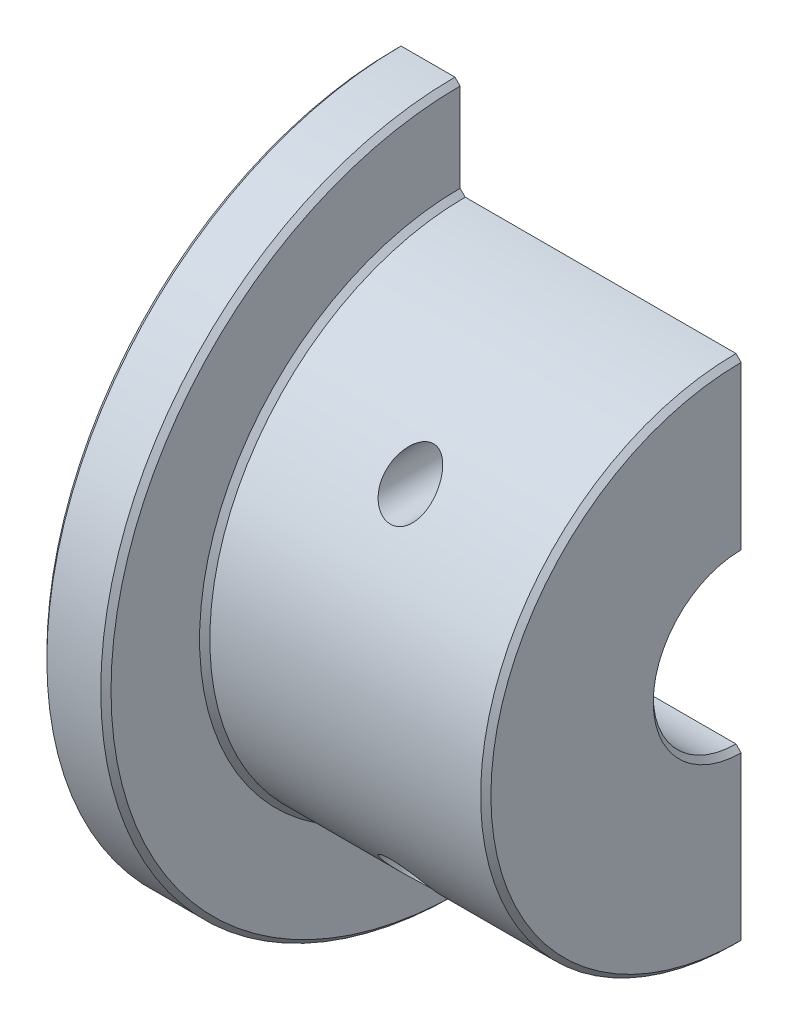
ISO-10303-21;
HEADER;
FILE_DESCRIPTION(('STEP AP214'),'2;1');
FILE_NAME('part.step','',(''),(''),'','','');
FILE_SCHEMA(('AUTOMOTIVE_DESIGN { 1 0 10303 214 1 1 1 1 }'));
ENDSEC;
DATA;
#1=APPLICATION_CONTEXT('core data for automotive mechanical design processes');
#2=APPLICATION_PROTOCOL_DEFINITION('international standard','automotive_design',2000,#1);
#3=PRODUCT_CONTEXT('',#1,'mechanical');
#4=PRODUCT('Part','Part','',(#3));
#5=PRODUCT_RELATED_PRODUCT_CATEGORY('part','',(#4));
#6=PRODUCT_DEFINITION_FORMATION('','',#4);
#7=PRODUCT_DEFINITION_CONTEXT('part definition',#1,'design');
#8=PRODUCT_DEFINITION('design','',#6,#7);
#9=PRODUCT_DEFINITION_SHAPE('','',#8);
#10=(LENGTH_UNIT() NAMED_UNIT(*) SI_UNIT(.MILLI.,.METRE.));
#11=(NAMED_UNIT(*) PLANE_ANGLE_UNIT() SI_UNIT($,.RADIAN.));
#12=(NAMED_UNIT(*) SI_UNIT($,.STERADIAN.) SOLID_ANGLE_UNIT());
#13=UNCERTAINTY_MEASURE_WITH_UNIT(LENGTH_MEASURE(1.E-05),#10,'distance_accuracy_value','');
#14=(GEOMETRIC_REPRESENTATION_CONTEXT(3) GLOBAL_UNCERTAINTY_ASSIGNED_CONTEXT((#13)) GLOBAL_UNIT_ASSIGNED_CONTEXT((#10,
#11,#12)) REPRESENTATION_CONTEXT('',''));
#15=CARTESIAN_POINT('',(0.,0.,0.));
#16=DIRECTION('',(0.,0.,1.));
#17=DIRECTION('',(1.,0.,0.));
#18=AXIS2_PLACEMENT_3D('',#15,#16,#17);
#19=CARTESIAN_POINT('',(4.7625,0.,0.));
#20=DIRECTION('',(1.,0.,0.));
#21=DIRECTION('',(0.,0.,-1.));
#22=AXIS2_PLACEMENT_3D('',#19,#20,#21);
#23=PLANE('',#22);
#24=CARTESIAN_POINT('',(4.7625,0.,0.));
#25=DIRECTION('',(-1.,0.,0.));
#26=DIRECTION('',(0.,0.,1.));
#27=AXIS2_PLACEMENT_3D('',#24,#25,#26);
#28=CIRCLE('',#27,10.16);
#29=CARTESIAN_POINT('',(4.7625,-10.16,0.));
#30=VERTEX_POINT('',#29);
#31=CARTESIAN_POINT('',(4.7625,10.16,0.));
#32=VERTEX_POINT('',#31);
#33=EDGE_CURVE('E56',#30,#32,#28,.T.);
#34=ORIENTED_EDGE('',*,*,#33,.F.);
#35=DIRECTION('',(0.,-1.,0.));
#36=VECTOR('',#35,1.);
#37=CARTESIAN_POINT('',(4.7625,0.,0.));
#38=LINE('',#37,#36);
#39=CARTESIAN_POINT('',(4.7625,-17.272,0.));
#40=VERTEX_POINT('',#39);
#41=EDGE_CURVE('E225',#30,#40,#38,.T.);
#42=ORIENTED_EDGE('',*,*,#41,.T.);
#43=CARTESIAN_POINT('',(4.7625,0.,0.));
#44=DIRECTION('',(1.,0.,0.));
#45=DIRECTION('',(0.,0.,-1.));
#46=AXIS2_PLACEMENT_3D('',#43,#44,#45);
#47=CIRCLE('',#46,17.272);
#48=CARTESIAN_POINT('',(4.7625,17.272,0.));
#49=VERTEX_POINT('',#48);
#50=EDGE_CURVE('E257',#40,#49,#47,.F.);
#51=ORIENTED_EDGE('',*,*,#50,.T.);
#52=EDGE_CURVE('E222',#49,#32,#38,.T.);
#53=ORIENTED_EDGE('',*,*,#52,.T.);
#54=EDGE_LOOP('',(#34,#42,#51,#53));
#55=FACE_BOUND('',#54,.T.);
#56=ADVANCED_FACE('F41',(#55),#23,.F.);
#57=CARTESIAN_POINT('',(4.7625,0.,0.));
#58=DIRECTION('',(1.,0.,0.));
#59=DIRECTION('',(0.,0.,1.));
#60=AXIS2_PLACEMENT_3D('',#57,#58,#59);
#61=CIRCLE('',#60,6.604);
#62=CARTESIAN_POINT('',(4.7625,6.604,0.));
#63=VERTEX_POINT('',#62);
#64=CARTESIAN_POINT('',(4.7625,-6.604,0.));
#65=VERTEX_POINT('',#64);
#66=EDGE_CURVE('E64',#63,#65,#61,.T.);
#67=ORIENTED_EDGE('',*,*,#66,.F.);
#68=CARTESIAN_POINT('',(4.7625,4.09575,0.));
#69=VERTEX_POINT('',#68);
#70=EDGE_CURVE('E221',#63,#69,#38,.T.);
#71=ORIENTED_EDGE('',*,*,#70,.T.);
#72=CARTESIAN_POINT('',(4.7625,0.,0.));
#73=DIRECTION('',(-1.,0.,0.));
#74=DIRECTION('',(0.,0.,1.));
#75=AXIS2_PLACEMENT_3D('',#72,#73,#74);
#76=CIRCLE('',#75,4.09575);
#77=CARTESIAN_POINT('',(4.7625,-4.09575,0.));
#78=VERTEX_POINT('',#77);
#79=EDGE_CURVE('E256',#69,#78,#76,.F.);
#80=ORIENTED_EDGE('',*,*,#79,.T.);
#81=EDGE_CURVE('E226',#78,#65,#38,.T.);
#82=ORIENTED_EDGE('',*,*,#81,.T.);
#83=EDGE_LOOP('',(#67,#71,#80,#82));
#84=FACE_BOUND('',#83,.T.);
#85=ADVANCED_FACE('F344',(#84),#23,.F.);
#86=CARTESIAN_POINT('',(21.844,0.,0.));
#87=DIRECTION('',(-1.,0.,0.));
#88=DIRECTION('',(0.,0.,1.));
#89=AXIS2_PLACEMENT_3D('',#86,#87,#88);
#90=CYLINDRICAL_SURFACE('',#89,12.6365);
#91=CARTESIAN_POINT('',(13.700125,8.366125,9.47043213028714));
#92=CARTESIAN_POINT('',(13.7001249621737,8.44128960350718,9.40402911952569));
#93=CARTESIAN_POINT('',(13.7072361151167,8.51572369041379,9.33667011488809));
#94=CARTESIAN_POINT('',(13.7350160890176,8.66180315074099,9.20132063768795));
#95=CARTESIAN_POINT('',(13.7557355816915,8.73343703698933,9.13332874500871));
#96=CARTESIAN_POINT('',(13.8163498860264,8.88711774234203,8.98409258127698));
#97=CARTESIAN_POINT('',(13.8593519848088,8.96820308461127,8.90305530751382));
#98=CARTESIAN_POINT('',(13.9389738165955,9.08297069365219,8.78543190710075));
#99=CARTESIAN_POINT('',(13.9680067263493,9.12005786224692,8.7469070029641));
#100=CARTESIAN_POINT('',(14.0313495310548,9.19153226741887,8.67176676838497));
#101=CARTESIAN_POINT('',(14.0656544591567,9.2259219997043,8.63514968358997));
#102=CARTESIAN_POINT('',(14.1425495101344,9.29381356195197,8.56205753877473));
#103=CARTESIAN_POINT('',(14.185562891196,9.32706504405481,8.52579008631979));
#104=CARTESIAN_POINT('',(14.2782751918706,9.38864623833255,8.45792800520883));
#105=CARTESIAN_POINT('',(14.3279631674423,9.41698383692184,8.42632590136842));
#106=CARTESIAN_POINT('',(14.4234241849854,9.4622076821949,8.37548085591997));
#107=CARTESIAN_POINT('',(14.4679954430909,9.48025067443462,8.35503011842458));
#108=CARTESIAN_POINT('',(14.5610112526392,9.51122605133018,8.31975146262236));
#109=CARTESIAN_POINT('',(14.6094529568515,9.52416215191755,8.30491945627258));
#110=CARTESIAN_POINT('',(14.7096767770832,9.54401709267878,8.28209562937027));
#111=CARTESIAN_POINT('',(14.7614865672625,9.55087679133372,8.27417105033155));
#112=CARTESIAN_POINT('',(14.866147097949,9.55764691457447,8.26635042790922));
#113=CARTESIAN_POINT('',(14.9189968964914,9.55756336218896,8.26644742608613));
#114=CARTESIAN_POINT('',(15.0157504177274,9.55101257425573,8.27401381318431));
#115=CARTESIAN_POINT('',(15.0598138637474,9.5454982904683,8.28038264555512));
#116=CARTESIAN_POINT('',(15.1460124112454,9.52989036883062,8.29834096323622));
#117=CARTESIAN_POINT('',(15.1881465909176,9.51979456654955,8.3099329160687));
#118=CARTESIAN_POINT('',(15.2826106420355,9.49180979450326,8.34189758731687));
#119=CARTESIAN_POINT('',(15.3339589529615,9.47246665072018,8.36388715094059));
#120=CARTESIAN_POINT('',(15.4312545954451,9.42834491551374,8.41359332600756));
#121=CARTESIAN_POINT('',(15.4771910603997,9.4035556651263,8.44132116197137));
#122=CARTESIAN_POINT('',(15.581828496394,9.33836089460264,8.51348243156677));
#123=CARTESIAN_POINT('',(15.637713417752,9.29578440203451,8.56002203547779));
#124=CARTESIAN_POINT('',(15.7389537031895,9.20445696034513,8.65815436828773));
#125=CARTESIAN_POINT('',(15.7842885811613,9.15569427778544,8.70975665635828));
#126=CARTESIAN_POINT('',(15.8798837865719,9.03479614917057,8.83536480962547));
#127=CARTESIAN_POINT('',(15.9258857711021,8.96063317636269,8.91066437246362));
#128=CARTESIAN_POINT('',(16.0004289403033,8.80608355331776,9.06343659892184));
#129=CARTESIAN_POINT('',(16.0289547496607,8.72569149264322,9.14091111355555));
#130=CARTESIAN_POINT('',(16.0687244211291,8.55942999041986,9.29679770710956));
#131=CARTESIAN_POINT('',(16.0797252615439,8.47350043368963,9.37520802989711));
#132=CARTESIAN_POINT('',(16.0826792371569,8.2993125935185,9.52974561292135));
#133=CARTESIAN_POINT('',(16.0746520027033,8.2110568028427,9.60587514407854));
#134=CARTESIAN_POINT('',(16.0415814815943,8.05248371527792,9.73895054505186));
#135=CARTESIAN_POINT('',(16.0202263348612,7.98207817019831,9.79670788073001));
#136=CARTESIAN_POINT('',(15.9632159308205,7.84363895408847,9.90789073469402));
#137=CARTESIAN_POINT('',(15.9275779435652,7.77560252604347,9.96132139111971));
#138=CARTESIAN_POINT('',(15.8498005958787,7.65777788614727,10.0520630109625));
#139=CARTESIAN_POINT('',(15.8103629372137,7.60705115204527,10.0904667233611));
#140=CARTESIAN_POINT('',(15.7216601414133,7.51088148760151,10.1622526429461));
#141=CARTESIAN_POINT('',(15.672405777788,7.4654328505098,10.1956402852688));
#142=CARTESIAN_POINT('',(15.5730198476984,7.38868287154303,10.2513603892714));
#143=CARTESIAN_POINT('',(15.5242533773118,7.35628079810179,10.2746059843722));
#144=CARTESIAN_POINT('',(15.4207548269383,7.2983262525384,10.3158534857517));
#145=CARTESIAN_POINT('',(15.3660247583626,7.2727714809453,10.3338571525589));
#146=CARTESIAN_POINT('',(15.2515248833607,7.22982100029259,10.363952886819));
#147=CARTESIAN_POINT('',(15.1917288785629,7.21247119674575,10.3760117093675));
#148=CARTESIAN_POINT('',(15.0692236294389,7.18729582121187,10.3934668325949));
#149=CARTESIAN_POINT('',(15.0065158219238,7.17946560262023,10.3988663837492));
#150=CARTESIAN_POINT('',(14.8867893651784,7.17415241603533,10.4025321224922));
#151=CARTESIAN_POINT('',(14.8298308993087,7.17571044278515,10.4014594311292));
#152=CARTESIAN_POINT('',(14.717104639766,7.18687057676073,10.3937514471977));
#153=CARTESIAN_POINT('',(14.6613366031128,7.19647102602101,10.3871173011368));
#154=CARTESIAN_POINT('',(14.5537672382196,7.22286990585791,10.3687767154043));
#155=CARTESIAN_POINT('',(14.501905528428,7.23950480042156,10.3571854528784));
#156=CARTESIAN_POINT('',(14.4019952945143,7.27911215682411,10.3293872611446));
#157=CARTESIAN_POINT('',(14.35394761423,7.30208601612763,10.3131793141342));
#158=CARTESIAN_POINT('',(14.2591300079431,7.35527705958827,10.275318480188));
#159=CARTESIAN_POINT('',(14.2127168195524,7.38590402047124,10.2533517588235));
#160=CARTESIAN_POINT('',(14.1258785204621,7.45204460236712,10.2053825536506));
#161=CARTESIAN_POINT('',(14.085455263081,7.48755972927737,10.1793788258445));
#162=CARTESIAN_POINT('',(14.0053516258173,7.56779771791837,10.1199015962278));
#163=CARTESIAN_POINT('',(13.9666584036623,7.61310623174809,10.0858920171087));
#164=CARTESIAN_POINT('',(13.8974611819882,7.70705172948978,10.0142893024146));
#165=CARTESIAN_POINT('',(13.8669674128035,7.75569277732785,9.97669176867938));
#166=CARTESIAN_POINT('',(13.8015325463979,7.87825163588006,9.88042677662465));
#167=CARTESIAN_POINT('',(13.7711815130484,7.9533516774247,9.82012898917282));
#168=CARTESIAN_POINT('',(13.726479290533,8.10478402267056,9.69552643994946));
#169=CARTESIAN_POINT('',(13.7121220808482,8.18111585170852,9.63122319557425));
#170=CARTESIAN_POINT('',(13.7017776444015,8.29348542206102,9.53423229801987));
#171=CARTESIAN_POINT('',(13.7001250182351,8.32989009537458,9.50244329843694));
#172=CARTESIAN_POINT('',(13.700125,8.366125,9.47043213028714));
#173=B_SPLINE_CURVE_WITH_KNOTS('',3,(#91,#92,#93,#94,#95,#96,#97,#98,#99,#100,#101,#102,#103,
#104,#105,#106,#107,#108,#109,#110,#111,#112,#113,#114,#115,#116,#117,#118,#119,#120,#121,#122,
#123,#124,#125,#126,#127,#128,#129,#130,#131,#132,#133,#134,#135,#136,#137,#138,#139,#140,#141,
#142,#143,#144,#145,#146,#147,#148,#149,#150,#151,#152,#153,#154,#155,#156,#157,#158,#159,#160,
#161,#162,#163,#164,#165,#166,#167,#168,#169,#170,#171,#172),.UNSPECIFIED.,.T.,.F.,(4,2,2,2,2,2,
2,2,2,2,2,2,2,2,2,2,2,2,2,2,2,2,2,2,2,2,2,2,2,2,2,2,2,2,2,2,2,2,2,2,4),(0.,0.300787109868074,
0.602700622545201,0.967848949682184,1.15014932710242,1.33227899764696,1.52777388950457,
1.72295206289406,1.8791282303125,2.03519054876395,2.19275563893867,2.35018404830815,
2.48415739282459,2.61819409589726,2.79455414661929,2.97126248887223,3.22269184285311,
3.47460542348275,3.81861392412164,4.16292464599808,4.51196967385705,4.86065476551903,
5.1402266292449,5.41946146450957,5.64317409193046,5.8666425407997,6.05484496814491,
6.24298411363663,6.43216376686685,6.62125104249512,6.79137396906287,6.96146183299297,
7.1277958503696,7.29416656646451,7.47283035292795,7.65154930405978,7.85660283232496,
8.06191102798851,8.36323992079128,8.66445534667431,8.80945700610014),.UNSPECIFIED.);
#174=CARTESIAN_POINT('',(13.700125,8.366125,9.47043213028714));
#175=VERTEX_POINT('',#174);
#176=EDGE_CURVE('E204',#175,#175,#173,.T.);
#177=ORIENTED_EDGE('',*,*,#176,.T.);
#178=EDGE_LOOP('',(#177));
#179=FACE_BOUND('',#178,.T.);
#180=CARTESIAN_POINT('',(21.59,0.,0.));
#181=DIRECTION('',(1.,0.,0.));
#182=DIRECTION('',(0.,0.,-1.));
#183=AXIS2_PLACEMENT_3D('',#180,#181,#182);
#184=CIRCLE('',#183,12.6365);
#185=CARTESIAN_POINT('',(21.59,-12.6365,0.));
#186=VERTEX_POINT('',#185);
#187=CARTESIAN_POINT('',(21.59,12.6365,0.));
#188=VERTEX_POINT('',#187);
#189=EDGE_CURVE('E278',#186,#188,#184,.F.);
#190=ORIENTED_EDGE('',*,*,#189,.T.);
#191=DIRECTION('',(-1.,0.,0.));
#192=VECTOR('',#191,1.);
#193=CARTESIAN_POINT('',(21.844,12.6365,0.));
#194=LINE('',#193,#192);
#195=CARTESIAN_POINT('',(8.19150000000001,12.6365,0.));
#196=VERTEX_POINT('',#195);
#197=EDGE_CURVE('E218',#188,#196,#194,.T.);
#198=ORIENTED_EDGE('',*,*,#197,.T.);
#199=CARTESIAN_POINT('',(8.19150000000001,0.,0.));
#200=DIRECTION('',(1.,0.,0.));
#201=DIRECTION('',(0.,0.,-1.));
#202=AXIS2_PLACEMENT_3D('',#199,#200,#201);
#203=CIRCLE('',#202,12.6365);
#204=CARTESIAN_POINT('',(8.19150000000001,-12.6365,0.));
#205=VERTEX_POINT('',#204);
#206=EDGE_CURVE('E275',#196,#205,#203,.T.);
#207=ORIENTED_EDGE('',*,*,#206,.T.);
#208=DIRECTION('',(-1.,0.,0.));
#209=VECTOR('',#208,1.);
#210=CARTESIAN_POINT('',(21.844,-12.6365,0.));
#211=LINE('',#210,#209);
#212=EDGE_CURVE('E243',#205,#186,#211,.F.);
#213=ORIENTED_EDGE('',*,*,#212,.T.);
#214=EDGE_LOOP('',(#190,#198,#207,#213));
#215=FACE_BOUND('',#214,.T.);
#216=CARTESIAN_POINT('',(13.700125,-8.366125,9.47043213028714));
#217=CARTESIAN_POINT('',(13.7001249621737,-8.44128960350718,9.40402911952569));
#218=CARTESIAN_POINT('',(13.7072361151167,-8.51572369041379,9.33667011488809));
#219=CARTESIAN_POINT('',(13.7350160890176,-8.66180315074099,9.20132063768795));
#220=CARTESIAN_POINT('',(13.7557355816915,-8.73343703698933,9.13332874500871));
#221=CARTESIAN_POINT('',(13.8163498860264,-8.88711774234203,8.98409258127698));
#222=CARTESIAN_POINT('',(13.8593519848088,-8.96820308461127,8.90305530751382));
#223=CARTESIAN_POINT('',(13.9389738165955,-9.08297069365219,8.78543190710075));
#224=CARTESIAN_POINT('',(13.9680067263493,-9.12005786224692,8.7469070029641));
#225=CARTESIAN_POINT('',(14.0313495310548,-9.19153226741887,8.67176676838497));
#226=CARTESIAN_POINT('',(14.0656544591567,-9.2259219997043,8.63514968358997));
#227=CARTESIAN_POINT('',(14.1425495101344,-9.29381356195197,8.56205753877473));
#228=CARTESIAN_POINT('',(14.185562891196,-9.32706504405481,8.52579008631979));
#229=CARTESIAN_POINT('',(14.2782751918706,-9.38864623833255,8.45792800520883));
#230=CARTESIAN_POINT('',(14.3279631674423,-9.41698383692184,8.42632590136842));
#231=CARTESIAN_POINT('',(14.4234241849854,-9.4622076821949,8.37548085591997));
#232=CARTESIAN_POINT('',(14.4679954430909,-9.48025067443462,8.35503011842458));
#233=CARTESIAN_POINT('',(14.5610112526392,-9.51122605133018,8.31975146262236));
#234=CARTESIAN_POINT('',(14.6094529568515,-9.52416215191755,8.30491945627258));
#235=CARTESIAN_POINT('',(14.7096767770832,-9.54401709267878,8.28209562937027));
#236=CARTESIAN_POINT('',(14.7614865672625,-9.55087679133372,8.27417105033155));
#237=CARTESIAN_POINT('',(14.866147097949,-9.55764691457447,8.26635042790922));
#238=CARTESIAN_POINT('',(14.9189968964914,-9.55756336218896,8.26644742608613));
#239=CARTESIAN_POINT('',(15.0157504177274,-9.55101257425573,8.27401381318431));
#240=CARTESIAN_POINT('',(15.0598138637474,-9.5454982904683,8.28038264555512));
#241=CARTESIAN_POINT('',(15.1460124112454,-9.52989036883062,8.29834096323622));
#242=CARTESIAN_POINT('',(15.1881465909176,-9.51979456654955,8.3099329160687));
#243=CARTESIAN_POINT('',(15.2826106420355,-9.49180979450326,8.34189758731687));
#244=CARTESIAN_POINT('',(15.3339589529615,-9.47246665072018,8.36388715094059));
#245=CARTESIAN_POINT('',(15.4312545954451,-9.42834491551374,8.41359332600756));
#246=CARTESIAN_POINT('',(15.4771910603997,-9.4035556651263,8.44132116197137));
#247=CARTESIAN_POINT('',(15.581828496394,-9.33836089460264,8.51348243156677));
#248=CARTESIAN_POINT('',(15.637713417752,-9.29578440203451,8.56002203547779));
#249=CARTESIAN_POINT('',(15.7389537031895,-9.20445696034513,8.65815436828773));
#250=CARTESIAN_POINT('',(15.7842885811613,-9.15569427778544,8.70975665635828));
#251=CARTESIAN_POINT('',(15.8798837865719,-9.03479614917057,8.83536480962547));
#252=CARTESIAN_POINT('',(15.9258857711021,-8.96063317636269,8.91066437246362));
#253=CARTESIAN_POINT('',(16.0004289403033,-8.80608355331776,9.06343659892184));
#254=CARTESIAN_POINT('',(16.0289547496607,-8.72569149264322,9.14091111355555));
#255=CARTESIAN_POINT('',(16.0687244211291,-8.55942999041986,9.29679770710956));
#256=CARTESIAN_POINT('',(16.0797252615439,-8.47350043368963,9.37520802989711));
#257=CARTESIAN_POINT('',(16.0826792371569,-8.2993125935185,9.52974561292135));
#258=CARTESIAN_POINT('',(16.0746520027033,-8.2110568028427,9.60587514407854));
#259=CARTESIAN_POINT('',(16.0415814815943,-8.05248371527792,9.73895054505186));
#260=CARTESIAN_POINT('',(16.0202263348612,-7.98207817019831,9.79670788073001));
#261=CARTESIAN_POINT('',(15.9632159308205,-7.84363895408847,9.90789073469402));
#262=CARTESIAN_POINT('',(15.9275779435652,-7.77560252604347,9.96132139111971));
#263=CARTESIAN_POINT('',(15.8498005958787,-7.65777788614727,10.0520630109625));
#264=CARTESIAN_POINT('',(15.8103629372137,-7.60705115204527,10.0904667233611));
#265=CARTESIAN_POINT('',(15.7216601414133,-7.51088148760151,10.1622526429461));
#266=CARTESIAN_POINT('',(15.672405777788,-7.4654328505098,10.1956402852688));
#267=CARTESIAN_POINT('',(15.5730198476984,-7.38868287154303,10.2513603892714));
#268=CARTESIAN_POINT('',(15.5242533773118,-7.35628079810179,10.2746059843722));
#269=CARTESIAN_POINT('',(15.4207548269383,-7.2983262525384,10.3158534857517));
#270=CARTESIAN_POINT('',(15.3660247583626,-7.2727714809453,10.3338571525589));
#271=CARTESIAN_POINT('',(15.2515248833607,-7.22982100029259,10.363952886819));
#272=CARTESIAN_POINT('',(15.1917288785629,-7.21247119674575,10.3760117093675));
#273=CARTESIAN_POINT('',(15.0692236294389,-7.18729582121187,10.3934668325949));
#274=CARTESIAN_POINT('',(15.0065158219238,-7.17946560262023,10.3988663837492));
#275=CARTESIAN_POINT('',(14.8867893651784,-7.17415241603533,10.4025321224922));
#276=CARTESIAN_POINT('',(14.8298308993087,-7.17571044278515,10.4014594311292));
#277=CARTESIAN_POINT('',(14.717104639766,-7.18687057676073,10.3937514471977));
#278=CARTESIAN_POINT('',(14.6613366031128,-7.19647102602101,10.3871173011368));
#279=CARTESIAN_POINT('',(14.5537672382196,-7.22286990585791,10.3687767154043));
#280=CARTESIAN_POINT('',(14.501905528428,-7.23950480042156,10.3571854528784));
#281=CARTESIAN_POINT('',(14.4019952945143,-7.27911215682411,10.3293872611446));
#282=CARTESIAN_POINT('',(14.35394761423,-7.30208601612763,10.3131793141342));
#283=CARTESIAN_POINT('',(14.2591300079431,-7.35527705958827,10.275318480188));
#284=CARTESIAN_POINT('',(14.2127168195524,-7.38590402047124,10.2533517588235));
#285=CARTESIAN_POINT('',(14.1258785204621,-7.45204460236712,10.2053825536506));
#286=CARTESIAN_POINT('',(14.085455263081,-7.48755972927737,10.1793788258445));
#287=CARTESIAN_POINT('',(14.0053516258173,-7.56779771791837,10.1199015962278));
#288=CARTESIAN_POINT('',(13.9666584036623,-7.61310623174809,10.0858920171087));
#289=CARTESIAN_POINT('',(13.8974611819882,-7.70705172948978,10.0142893024146));
#290=CARTESIAN_POINT('',(13.8669674128035,-7.75569277732785,9.97669176867938));
#291=CARTESIAN_POINT('',(13.8015325463979,-7.87825163588006,9.88042677662465));
#292=CARTESIAN_POINT('',(13.7711815130484,-7.9533516774247,9.82012898917282));
#293=CARTESIAN_POINT('',(13.726479290533,-8.10478402267056,9.69552643994946));
#294=CARTESIAN_POINT('',(13.7121220808482,-8.18111585170852,9.63122319557425));
#295=CARTESIAN_POINT('',(13.7017776444015,-8.29348542206102,9.53423229801987));
#296=CARTESIAN_POINT('',(13.7001250182351,-8.32989009537458,9.50244329843694));
#297=CARTESIAN_POINT('',(13.700125,-8.366125,9.47043213028714));
#298=B_SPLINE_CURVE_WITH_KNOTS('',3,(#216,#217,#218,#219,#220,#221,#222,#223,#224,#225,#226,
#227,#228,#229,#230,#231,#232,#233,#234,#235,#236,#237,#238,#239,#240,#241,#242,#243,#244,#245,
#246,#247,#248,#249,#250,#251,#252,#253,#254,#255,#256,#257,#258,#259,#260,#261,#262,#263,#264,
#265,#266,#267,#268,#269,#270,#271,#272,#273,#274,#275,#276,#277,#278,#279,#280,#281,#282,#283,
#284,#285,#286,#287,#288,#289,#290,#291,#292,#293,#294,#295,#296,#297),.UNSPECIFIED.,.T.,.F.,(4,
2,2,2,2,2,2,2,2,2,2,2,2,2,2,2,2,2,2,2,2,2,2,2,2,2,2,2,2,2,2,2,2,2,2,2,2,2,2,2,4),(0.,
0.300787109868074,0.602700622545201,0.967848949682184,1.15014932710242,1.33227899764696,
1.52777388950457,1.72295206289406,1.8791282303125,2.03519054876395,2.19275563893867,
2.35018404830815,2.48415739282459,2.61819409589726,2.79455414661929,2.97126248887223,
3.22269184285311,3.47460542348275,3.81861392412164,4.16292464599808,4.51196967385705,
4.86065476551903,5.1402266292449,5.41946146450957,5.64317409193046,5.8666425407997,
6.05484496814491,6.24298411363663,6.43216376686685,6.62125104249512,6.79137396906287,
6.96146183299297,7.1277958503696,7.29416656646451,7.47283035292795,7.65154930405978,
7.85660283232496,8.06191102798851,8.36323992079128,8.66445534667431,8.80945700610014),.UNSPECIFIED.);
#299=CARTESIAN_POINT('',(13.700125,-8.366125,9.47043213028714));
#300=VERTEX_POINT('',#299);
#301=EDGE_CURVE('E171',#300,#300,#298,.T.);
#302=ORIENTED_EDGE('',*,*,#301,.F.);
#303=EDGE_LOOP('',(#302));
#304=FACE_BOUND('',#303,.T.);
#305=ADVANCED_FACE('F186',(#179,#215,#304),#90,.T.);
#306=CARTESIAN_POINT('',(0.,0.,0.));
#307=DIRECTION('',(1.,0.,0.));
#308=DIRECTION('',(0.,0.,-1.));
#309=AXIS2_PLACEMENT_3D('',#306,#307,#308);
#310=CYLINDRICAL_SURFACE('',#309,4.09575);
#311=CARTESIAN_POINT('',(21.59,0.,0.));
#312=DIRECTION('',(1.,0.,0.));
#313=DIRECTION('',(0.,0.,-1.));
#314=AXIS2_PLACEMENT_3D('',#311,#312,#313);
#315=CIRCLE('',#314,4.09575);
#316=CARTESIAN_POINT('',(21.59,4.09575,0.));
#317=VERTEX_POINT('',#316);
#318=CARTESIAN_POINT('',(21.59,-4.09575,0.));
#319=VERTEX_POINT('',#318);
#320=EDGE_CURVE('E281',#317,#319,#315,.T.);
#321=ORIENTED_EDGE('',*,*,#320,.T.);
#322=DIRECTION('',(1.,0.,0.));
#323=VECTOR('',#322,1.);
#324=CARTESIAN_POINT('',(0.,-4.09575,0.));
#325=LINE('',#324,#323);
#326=EDGE_CURVE('E238',#319,#78,#325,.F.);
#327=ORIENTED_EDGE('',*,*,#326,.T.);
#328=ORIENTED_EDGE('',*,*,#79,.F.);
#329=DIRECTION('',(1.,0.,0.));
#330=VECTOR('',#329,1.);
#331=CARTESIAN_POINT('',(0.,4.09575,0.));
#332=LINE('',#331,#330);
#333=EDGE_CURVE('E212',#69,#317,#332,.T.);
#334=ORIENTED_EDGE('',*,*,#333,.T.);
#335=EDGE_LOOP('',(#321,#327,#328,#334));
#336=FACE_BOUND('',#335,.T.);
#337=ADVANCED_FACE('F296',(#336),#310,.F.);
#338=CARTESIAN_POINT('',(4.7625,0.,0.));
#339=DIRECTION('',(1.,0.,0.));
#340=DIRECTION('',(0.,0.,-1.));
#341=AXIS2_PLACEMENT_3D('',#338,#339,#340);
#342=CYLINDRICAL_SURFACE('',#341,17.526);
#343=DIRECTION('',(1.,0.,0.));
#344=VECTOR('',#343,1.);
#345=CARTESIAN_POINT('',(4.7625,-17.526,0.));
#346=LINE('',#345,#344);
#347=CARTESIAN_POINT('',(7.68350000000001,-17.526,0.));
#348=VERTEX_POINT('',#347);
#349=CARTESIAN_POINT('',(5.0165,-17.526,0.));
#350=VERTEX_POINT('',#349);
#351=EDGE_CURVE('E252',#348,#350,#346,.F.);
#352=ORIENTED_EDGE('',*,*,#351,.F.);
#353=CARTESIAN_POINT('',(7.68350000000001,0.,0.));
#354=DIRECTION('',(1.,0.,0.));
#355=DIRECTION('',(0.,0.,-1.));
#356=AXIS2_PLACEMENT_3D('',#353,#354,#355);
#357=CIRCLE('',#356,17.526);
#358=CARTESIAN_POINT('',(7.68350000000001,17.526,0.));
#359=VERTEX_POINT('',#358);
#360=EDGE_CURVE('E260',#348,#359,#357,.F.);
#361=ORIENTED_EDGE('',*,*,#360,.T.);
#362=DIRECTION('',(1.,0.,0.));
#363=VECTOR('',#362,1.);
#364=CARTESIAN_POINT('',(4.7625,17.526,0.));
#365=LINE('',#364,#363);
#366=CARTESIAN_POINT('',(5.0165,17.526,0.));
#367=VERTEX_POINT('',#366);
#368=EDGE_CURVE('E233',#367,#359,#365,.T.);
#369=ORIENTED_EDGE('',*,*,#368,.F.);
#370=CARTESIAN_POINT('',(5.0165,0.,0.));
#371=DIRECTION('',(1.,0.,0.));
#372=DIRECTION('',(0.,0.,-1.));
#373=AXIS2_PLACEMENT_3D('',#370,#371,#372);
#374=CIRCLE('',#373,17.526);
#375=EDGE_CURVE('E263',#367,#350,#374,.T.);
#376=ORIENTED_EDGE('',*,*,#375,.T.);
#377=EDGE_LOOP('',(#352,#361,#369,#376));
#378=FACE_BOUND('',#377,.T.);
#379=ADVANCED_FACE('F327',(#378),#342,.T.);
#380=CARTESIAN_POINT('',(7.9375,0.,0.));
#381=DIRECTION('',(1.,0.,0.));
#382=DIRECTION('',(0.,0.,-1.));
#383=AXIS2_PLACEMENT_3D('',#380,#381,#382);
#384=PLANE('',#383);
#385=DIRECTION('',(0.,-1.,0.));
#386=VECTOR('',#385,1.);
#387=CARTESIAN_POINT('',(7.9375,0.,0.));
#388=LINE('',#387,#386);
#389=CARTESIAN_POINT('',(7.9375,17.272,0.));
#390=VERTEX_POINT('',#389);
#391=CARTESIAN_POINT('',(7.9375,12.8905,0.));
#392=VERTEX_POINT('',#391);
#393=EDGE_CURVE('E231',#390,#392,#388,.T.);
#394=ORIENTED_EDGE('',*,*,#393,.F.);
#395=CARTESIAN_POINT('',(7.9375,0.,0.));
#396=DIRECTION('',(1.,0.,0.));
#397=DIRECTION('',(0.,0.,-1.));
#398=AXIS2_PLACEMENT_3D('',#395,#396,#397);
#399=CIRCLE('',#398,17.272);
#400=CARTESIAN_POINT('',(7.9375,-17.272,0.));
#401=VERTEX_POINT('',#400);
#402=EDGE_CURVE('E269',#390,#401,#399,.T.);
#403=ORIENTED_EDGE('',*,*,#402,.T.);
#404=CARTESIAN_POINT('',(7.9375,-12.8905,0.));
#405=VERTEX_POINT('',#404);
#406=EDGE_CURVE('E234',#405,#401,#388,.T.);
#407=ORIENTED_EDGE('',*,*,#406,.F.);
#408=CARTESIAN_POINT('',(7.9375,0.,0.));
#409=DIRECTION('',(1.,0.,0.));
#410=DIRECTION('',(0.,0.,-1.));
#411=AXIS2_PLACEMENT_3D('',#408,#409,#410);
#412=CIRCLE('',#411,12.8905);
#413=EDGE_CURVE('E266',#405,#392,#412,.F.);
#414=ORIENTED_EDGE('',*,*,#413,.T.);
#415=EDGE_LOOP('',(#394,#403,#407,#414));
#416=FACE_BOUND('',#415,.T.);
#417=ADVANCED_FACE('F318',(#416),#384,.T.);
#418=CARTESIAN_POINT('',(21.844,0.,0.));
#419=DIRECTION('',(1.,0.,0.));
#420=DIRECTION('',(0.,0.,-1.));
#421=AXIS2_PLACEMENT_3D('',#418,#419,#420);
#422=PLANE('',#421);
#423=DIRECTION('',(0.,-1.,0.));
#424=VECTOR('',#423,1.);
#425=CARTESIAN_POINT('',(21.844,0.,0.));
#426=LINE('',#425,#424);
#427=CARTESIAN_POINT('',(21.844,12.3825,0.));
#428=VERTEX_POINT('',#427);
#429=CARTESIAN_POINT('',(21.844,4.34975,0.));
#430=VERTEX_POINT('',#429);
#431=EDGE_CURVE('E210',#428,#430,#426,.T.);
#432=ORIENTED_EDGE('',*,*,#431,.F.);
#433=CARTESIAN_POINT('',(21.844,0.,0.));
#434=DIRECTION('',(1.,0.,0.));
#435=DIRECTION('',(0.,0.,-1.));
#436=AXIS2_PLACEMENT_3D('',#433,#434,#435);
#437=CIRCLE('',#436,12.3825);
#438=CARTESIAN_POINT('',(21.844,-12.3825,0.));
#439=VERTEX_POINT('',#438);
#440=EDGE_CURVE('E272',#428,#439,#437,.T.);
#441=ORIENTED_EDGE('',*,*,#440,.T.);
#442=CARTESIAN_POINT('',(21.844,-4.34975,0.));
#443=VERTEX_POINT('',#442);
#444=EDGE_CURVE('E213',#443,#439,#426,.T.);
#445=ORIENTED_EDGE('',*,*,#444,.F.);
#446=CARTESIAN_POINT('',(21.844,0.,0.));
#447=DIRECTION('',(1.,0.,0.));
#448=DIRECTION('',(0.,0.,-1.));
#449=AXIS2_PLACEMENT_3D('',#446,#447,#448);
#450=CIRCLE('',#449,4.34975);
#451=EDGE_CURVE('E284',#443,#430,#450,.F.);
#452=ORIENTED_EDGE('',*,*,#451,.T.);
#453=EDGE_LOOP('',(#432,#441,#445,#452));
#454=FACE_BOUND('',#453,.T.);
#455=ADVANCED_FACE('F302',(#454),#422,.T.);
#456=CARTESIAN_POINT('',(5.0165,0.,0.));
#457=DIRECTION('',(1.,0.,0.));
#458=DIRECTION('',(0.,0.,-1.));
#459=AXIS2_PLACEMENT_3D('',#456,#457,#458);
#460=CONICAL_SURFACE('',#459,17.526,0.785398163397448);
#461=DIRECTION('',(0.707106781186547,-0.707106781186548,0.));
#462=VECTOR('',#461,1.);
#463=CARTESIAN_POINT('',(-12.5095,0.,0.));
#464=LINE('',#463,#462);
#465=EDGE_CURVE('E249',#350,#40,#464,.F.);
#466=ORIENTED_EDGE('',*,*,#465,.F.);
#467=ORIENTED_EDGE('',*,*,#375,.F.);
#468=DIRECTION('',(-0.707106781186547,-0.707106781186548,0.));
#469=VECTOR('',#468,1.);
#470=CARTESIAN_POINT('',(-12.5095,0.,0.));
#471=LINE('',#470,#469);
#472=EDGE_CURVE('E229',#49,#367,#471,.F.);
#473=ORIENTED_EDGE('',*,*,#472,.F.);
#474=ORIENTED_EDGE('',*,*,#50,.F.);
#475=EDGE_LOOP('',(#466,#467,#473,#474));
#476=FACE_BOUND('',#475,.T.);
#477=ADVANCED_FACE('F332',(#476),#460,.T.);
#478=CARTESIAN_POINT('',(7.9375,0.,0.));
#479=DIRECTION('',(-1.,0.,0.));
#480=DIRECTION('',(0.,0.,1.));
#481=AXIS2_PLACEMENT_3D('',#478,#479,#480);
#482=CONICAL_SURFACE('',#481,17.272,0.785398163397442);
#483=DIRECTION('',(-0.707106781186552,0.707106781186543,0.));
#484=VECTOR('',#483,1.);
#485=CARTESIAN_POINT('',(25.2095000000002,0.,0.));
#486=LINE('',#485,#484);
#487=EDGE_CURVE('E236',#359,#390,#486,.F.);
#488=ORIENTED_EDGE('',*,*,#487,.F.);
#489=ORIENTED_EDGE('',*,*,#360,.F.);
#490=DIRECTION('',(0.707106781186552,0.707106781186543,0.));
#491=VECTOR('',#490,1.);
#492=CARTESIAN_POINT('',(25.2095000000002,0.,0.));
#493=LINE('',#492,#491);
#494=EDGE_CURVE('E254',#401,#348,#493,.F.);
#495=ORIENTED_EDGE('',*,*,#494,.F.);
#496=ORIENTED_EDGE('',*,*,#402,.F.);
#497=EDGE_LOOP('',(#488,#489,#495,#496));
#498=FACE_BOUND('',#497,.T.);
#499=ADVANCED_FACE('F322',(#498),#482,.T.);
#500=CARTESIAN_POINT('',(21.844,0.,0.));
#501=DIRECTION('',(-1.,0.,0.));
#502=DIRECTION('',(0.,0.,1.));
#503=AXIS2_PLACEMENT_3D('',#500,#501,#502);
#504=CONICAL_SURFACE('',#503,12.3825,0.785398163397458);
#505=DIRECTION('',(-0.70710678118654,0.707106781186555,0.));
#506=VECTOR('',#505,1.);
#507=CARTESIAN_POINT('',(34.2264999999997,0.,0.));
#508=LINE('',#507,#506);
#509=EDGE_CURVE('E216',#188,#428,#508,.F.);
#510=ORIENTED_EDGE('',*,*,#509,.F.);
#511=ORIENTED_EDGE('',*,*,#189,.F.);
#512=DIRECTION('',(0.70710678118654,0.707106781186555,0.));
#513=VECTOR('',#512,1.);
#514=CARTESIAN_POINT('',(34.2264999999997,0.,0.));
#515=LINE('',#514,#513);
#516=EDGE_CURVE('E241',#439,#186,#515,.F.);
#517=ORIENTED_EDGE('',*,*,#516,.F.);
#518=ORIENTED_EDGE('',*,*,#440,.F.);
#519=EDGE_LOOP('',(#510,#511,#517,#518));
#520=FACE_BOUND('',#519,.T.);
#521=ADVANCED_FACE('F306',(#520),#504,.T.);
#522=CARTESIAN_POINT('',(8.19150000000001,0.,0.));
#523=DIRECTION('',(-1.,0.,0.));
#524=DIRECTION('',(0.,0.,1.));
#525=AXIS2_PLACEMENT_3D('',#522,#523,#524);
#526=CONICAL_SURFACE('',#525,12.6365,0.785398163397445);
#527=ORIENTED_EDGE('',*,*,#206,.F.);
#528=DIRECTION('',(-0.70710678118655,0.707106781186545,0.));
#529=VECTOR('',#528,1.);
#530=CARTESIAN_POINT('',(20.8280000000001,0.,0.));
#531=LINE('',#530,#529);
#532=EDGE_CURVE('E224',#196,#392,#531,.T.);
#533=ORIENTED_EDGE('',*,*,#532,.T.);
#534=ORIENTED_EDGE('',*,*,#413,.F.);
#535=DIRECTION('',(0.70710678118655,0.707106781186545,0.));
#536=VECTOR('',#535,1.);
#537=CARTESIAN_POINT('',(20.8280000000001,0.,0.));
#538=LINE('',#537,#536);
#539=EDGE_CURVE('E246',#405,#205,#538,.T.);
#540=ORIENTED_EDGE('',*,*,#539,.T.);
#541=EDGE_LOOP('',(#527,#533,#534,#540));
#542=FACE_BOUND('',#541,.T.);
#543=ADVANCED_FACE('F312',(#542),#526,.T.);
#544=CARTESIAN_POINT('',(21.59,0.,0.));
#545=DIRECTION('',(1.,0.,0.));
#546=DIRECTION('',(0.,0.,-1.));
#547=AXIS2_PLACEMENT_3D('',#544,#545,#546);
#548=CONICAL_SURFACE('',#547,4.09575,0.785398163397447);
#549=DIRECTION('',(0.707106781186549,-0.707106781186546,0.));
#550=VECTOR('',#549,1.);
#551=CARTESIAN_POINT('',(17.49425,0.,0.));
#552=LINE('',#551,#550);
#553=EDGE_CURVE('E11',#319,#443,#552,.T.);
#554=ORIENTED_EDGE('',*,*,#553,.F.);
#555=ORIENTED_EDGE('',*,*,#320,.F.);
#556=DIRECTION('',(-0.707106781186549,-0.707106781186546,0.));
#557=VECTOR('',#556,1.);
#558=CARTESIAN_POINT('',(17.49425,0.,0.));
#559=LINE('',#558,#557);
#560=EDGE_CURVE('E49',#430,#317,#559,.T.);
#561=ORIENTED_EDGE('',*,*,#560,.F.);
#562=ORIENTED_EDGE('',*,*,#451,.F.);
#563=EDGE_LOOP('',(#554,#555,#561,#562));
#564=FACE_BOUND('',#563,.T.);
#565=ADVANCED_FACE('F43',(#564),#548,.F.);
#566=CARTESIAN_POINT('',(0.,0.,0.));
#567=DIRECTION('',(0.,0.,1.));
#568=DIRECTION('',(1.,0.,0.));
#569=AXIS2_PLACEMENT_3D('',#566,#567,#568);
#570=PLANE('',#569);
#571=CARTESIAN_POINT('',(14.89075,8.366125,0.));
#572=DIRECTION('',(0.,0.,-1.));
#573=DIRECTION('',(-1.,0.,0.));
#574=AXIS2_PLACEMENT_3D('',#571,#572,#573);
#575=CIRCLE('',#574,1.190625);
#576=CARTESIAN_POINT('',(13.700125,8.366125,0.));
#577=VERTEX_POINT('',#576);
#578=EDGE_CURVE('E184',#577,#577,#575,.T.);
#579=ORIENTED_EDGE('',*,*,#578,.F.);
#580=EDGE_LOOP('',(#579));
#581=FACE_BOUND('',#580,.T.);
#582=ORIENTED_EDGE('',*,*,#487,.T.);
#583=ORIENTED_EDGE('',*,*,#393,.T.);
#584=ORIENTED_EDGE('',*,*,#532,.F.);
#585=ORIENTED_EDGE('',*,*,#197,.F.);
#586=ORIENTED_EDGE('',*,*,#509,.T.);
#587=ORIENTED_EDGE('',*,*,#431,.T.);
#588=ORIENTED_EDGE('',*,*,#560,.T.);
#589=ORIENTED_EDGE('',*,*,#333,.F.);
#590=ORIENTED_EDGE('',*,*,#70,.F.);
#591=DIRECTION('',(1.,0.,0.));
#592=VECTOR('',#591,1.);
#593=CARTESIAN_POINT('',(3.2385,6.604,0.));
#594=LINE('',#593,#592);
#595=CARTESIAN_POINT('',(3.2385,6.604,0.));
#596=VERTEX_POINT('',#595);
#597=EDGE_CURVE('E153',#596,#63,#594,.T.);
#598=ORIENTED_EDGE('',*,*,#597,.F.);
#599=DIRECTION('',(0.,-1.,0.));
#600=VECTOR('',#599,1.);
#601=CARTESIAN_POINT('',(3.2385,10.16,0.));
#602=LINE('',#601,#600);
#603=CARTESIAN_POINT('',(3.2385,10.16,0.));
#604=VERTEX_POINT('',#603);
#605=EDGE_CURVE('E147',#604,#596,#602,.T.);
#606=ORIENTED_EDGE('',*,*,#605,.F.);
#607=DIRECTION('',(1.,0.,0.));
#608=VECTOR('',#607,1.);
#609=CARTESIAN_POINT('',(3.2385,10.16,0.));
#610=LINE('',#609,#608);
#611=EDGE_CURVE('E151',#604,#32,#610,.T.);
#612=ORIENTED_EDGE('',*,*,#611,.T.);
#613=ORIENTED_EDGE('',*,*,#52,.F.);
#614=ORIENTED_EDGE('',*,*,#472,.T.);
#615=ORIENTED_EDGE('',*,*,#368,.T.);
#616=EDGE_LOOP('',(#582,#583,#584,#585,#586,#587,#588,#589,#590,#598,#606,#612,#613,#614,#615));
#617=FACE_BOUND('',#616,.T.);
#618=ADVANCED_FACE('F149',(#581,#617),#570,.F.);
#619=CARTESIAN_POINT('',(14.89075,-8.366125,0.));
#620=DIRECTION('',(0.,0.,1.));
#621=DIRECTION('',(-1.,0.,0.));
#622=AXIS2_PLACEMENT_3D('',#619,#620,#621);
#623=CIRCLE('',#622,1.190625);
#624=CARTESIAN_POINT('',(13.700125,-8.366125,0.));
#625=VERTEX_POINT('',#624);
#626=EDGE_CURVE('E168',#625,#625,#623,.T.);
#627=ORIENTED_EDGE('',*,*,#626,.T.);
#628=EDGE_LOOP('',(#627));
#629=FACE_BOUND('',#628,.T.);
#630=ORIENTED_EDGE('',*,*,#494,.T.);
#631=ORIENTED_EDGE('',*,*,#351,.T.);
#632=ORIENTED_EDGE('',*,*,#465,.T.);
#633=ORIENTED_EDGE('',*,*,#41,.F.);
#634=DIRECTION('',(1.,0.,0.));
#635=VECTOR('',#634,1.);
#636=CARTESIAN_POINT('',(3.2385,-10.16,0.));
#637=LINE('',#636,#635);
#638=CARTESIAN_POINT('',(3.2385,-10.16,0.));
#639=VERTEX_POINT('',#638);
#640=EDGE_CURVE('E334',#639,#30,#637,.T.);
#641=ORIENTED_EDGE('',*,*,#640,.F.);
#642=DIRECTION('',(0.,-1.,0.));
#643=VECTOR('',#642,1.);
#644=CARTESIAN_POINT('',(3.2385,-10.16,0.));
#645=LINE('',#644,#643);
#646=CARTESIAN_POINT('',(3.2385,-6.604,0.));
#647=VERTEX_POINT('',#646);
#648=EDGE_CURVE('E162',#647,#639,#645,.T.);
#649=ORIENTED_EDGE('',*,*,#648,.F.);
#650=DIRECTION('',(1.,0.,0.));
#651=VECTOR('',#650,1.);
#652=CARTESIAN_POINT('',(3.2385,-6.604,0.));
#653=LINE('',#652,#651);
#654=EDGE_CURVE('E173',#647,#65,#653,.T.);
#655=ORIENTED_EDGE('',*,*,#654,.T.);
#656=ORIENTED_EDGE('',*,*,#81,.F.);
#657=ORIENTED_EDGE('',*,*,#326,.F.);
#658=ORIENTED_EDGE('',*,*,#553,.T.);
#659=ORIENTED_EDGE('',*,*,#444,.T.);
#660=ORIENTED_EDGE('',*,*,#516,.T.);
#661=ORIENTED_EDGE('',*,*,#212,.F.);
#662=ORIENTED_EDGE('',*,*,#539,.F.);
#663=ORIENTED_EDGE('',*,*,#406,.T.);
#664=EDGE_LOOP('',(#630,#631,#632,#633,#641,#649,#655,#656,#657,#658,#659,#660,#661,#662,#663));
#665=FACE_BOUND('',#664,.T.);
#666=ADVANCED_FACE('F201',(#629,#665),#570,.F.);
#667=CARTESIAN_POINT('',(14.89075,8.366125,12.7));
#668=DIRECTION('',(0.,0.,-1.));
#669=DIRECTION('',(-1.,0.,0.));
#670=AXIS2_PLACEMENT_3D('',#667,#668,#669);
#671=CYLINDRICAL_SURFACE('',#670,1.190625);
#672=ORIENTED_EDGE('',*,*,#578,.T.);
#673=EDGE_LOOP('',(#672));
#674=FACE_BOUND('',#673,.T.);
#675=ORIENTED_EDGE('',*,*,#176,.F.);
#676=EDGE_LOOP('',(#675));
#677=FACE_BOUND('',#676,.T.);
#678=ADVANCED_FACE('F195',(#674,#677),#671,.F.);
#679=CARTESIAN_POINT('',(14.89075,-8.366125,12.7));
#680=DIRECTION('',(0.,0.,-1.));
#681=DIRECTION('',(-1.,0.,0.));
#682=AXIS2_PLACEMENT_3D('',#679,#680,#681);
#683=CYLINDRICAL_SURFACE('',#682,1.190625);
#684=ORIENTED_EDGE('',*,*,#626,.F.);
#685=EDGE_LOOP('',(#684));
#686=FACE_BOUND('',#685,.T.);
#687=ORIENTED_EDGE('',*,*,#301,.T.);
#688=EDGE_LOOP('',(#687));
#689=FACE_BOUND('',#688,.T.);
#690=ADVANCED_FACE('F190',(#686,#689),#683,.F.);
#691=CARTESIAN_POINT('',(3.2385,0.,0.));
#692=DIRECTION('',(1.,0.,0.));
#693=DIRECTION('',(0.,0.,-1.));
#694=AXIS2_PLACEMENT_3D('',#691,#692,#693);
#695=CYLINDRICAL_SURFACE('',#694,10.16);
#696=ORIENTED_EDGE('',*,*,#33,.T.);
#697=ORIENTED_EDGE('',*,*,#611,.F.);
#698=CARTESIAN_POINT('',(3.2385,0.,0.));
#699=DIRECTION('',(-1.,0.,0.));
#700=DIRECTION('',(0.,0.,1.));
#701=AXIS2_PLACEMENT_3D('',#698,#699,#700);
#702=CIRCLE('',#701,10.16);
#703=EDGE_CURVE('E157',#639,#604,#702,.T.);
#704=ORIENTED_EDGE('',*,*,#703,.F.);
#705=ORIENTED_EDGE('',*,*,#640,.T.);
#706=EDGE_LOOP('',(#696,#697,#704,#705));
#707=FACE_BOUND('',#706,.T.);
#708=ADVANCED_FACE('F167',(#707),#695,.T.);
#709=CARTESIAN_POINT('',(3.2385,0.,0.));
#710=DIRECTION('',(1.,0.,0.));
#711=DIRECTION('',(0.,0.,-1.));
#712=AXIS2_PLACEMENT_3D('',#709,#710,#711);
#713=CYLINDRICAL_SURFACE('',#712,6.604);
#714=ORIENTED_EDGE('',*,*,#66,.T.);
#715=ORIENTED_EDGE('',*,*,#654,.F.);
#716=CARTESIAN_POINT('',(3.2385,0.,0.));
#717=DIRECTION('',(1.,0.,0.));
#718=DIRECTION('',(0.,0.,1.));
#719=AXIS2_PLACEMENT_3D('',#716,#717,#718);
#720=CIRCLE('',#719,6.604);
#721=EDGE_CURVE('E156',#596,#647,#720,.T.);
#722=ORIENTED_EDGE('',*,*,#721,.F.);
#723=ORIENTED_EDGE('',*,*,#597,.T.);
#724=EDGE_LOOP('',(#714,#715,#722,#723));
#725=FACE_BOUND('',#724,.T.);
#726=ADVANCED_FACE('F343',(#725),#713,.F.);
#727=CARTESIAN_POINT('',(3.2385,0.,0.));
#728=DIRECTION('',(-1.,0.,0.));
#729=DIRECTION('',(0.,0.,1.));
#730=AXIS2_PLACEMENT_3D('',#727,#728,#729);
#731=PLANE('',#730);
#732=ORIENTED_EDGE('',*,*,#703,.T.);
#733=ORIENTED_EDGE('',*,*,#605,.T.);
#734=ORIENTED_EDGE('',*,*,#721,.T.);
#735=ORIENTED_EDGE('',*,*,#648,.T.);
#736=EDGE_LOOP('',(#732,#733,#734,#735));
#737=FACE_BOUND('',#736,.T.);
#738=ADVANCED_FACE('F160',(#737),#731,.T.);
#739=CLOSED_SHELL('',(#56,#85,#305,#337,#379,#417,#455,#477,#499,#521,#543,#565,#618,#666,#678,
#690,#708,#726,#738));
#740=MANIFOLD_SOLID_BREP('B2',#739);
#741=ADVANCED_BREP_SHAPE_REPRESENTATION('',(#18,#740),#14);
#742=SHAPE_DEFINITION_REPRESENTATION(#9,#741);
ENDSEC;
END-ISO-10303-21;
